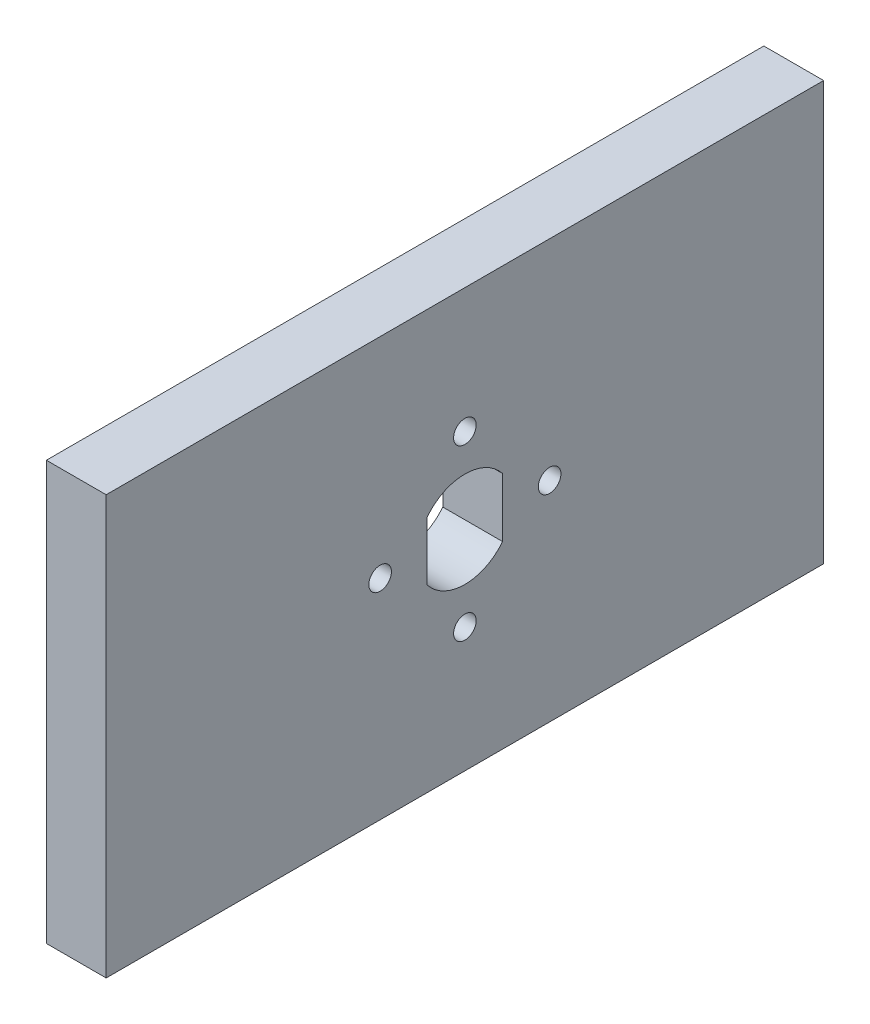
ISO-10303-21;
HEADER;
FILE_DESCRIPTION(('STEP AP214'),'2;1');
FILE_NAME('part.step','',(''),(''),'','','');
FILE_SCHEMA(('AUTOMOTIVE_DESIGN { 1 0 10303 214 1 1 1 1 }'));
ENDSEC;
DATA;
#1=APPLICATION_CONTEXT('core data for automotive mechanical design processes');
#2=APPLICATION_PROTOCOL_DEFINITION('international standard','automotive_design',2000,#1);
#3=PRODUCT_CONTEXT('',#1,'mechanical');
#4=PRODUCT('Part','Part','',(#3));
#5=PRODUCT_RELATED_PRODUCT_CATEGORY('part','',(#4));
#6=PRODUCT_DEFINITION_FORMATION('','',#4);
#7=PRODUCT_DEFINITION_CONTEXT('part definition',#1,'design');
#8=PRODUCT_DEFINITION('design','',#6,#7);
#9=PRODUCT_DEFINITION_SHAPE('','',#8);
#10=(LENGTH_UNIT() NAMED_UNIT(*) SI_UNIT(.MILLI.,.METRE.));
#11=(NAMED_UNIT(*) PLANE_ANGLE_UNIT() SI_UNIT($,.RADIAN.));
#12=(NAMED_UNIT(*) SI_UNIT($,.STERADIAN.) SOLID_ANGLE_UNIT());
#13=UNCERTAINTY_MEASURE_WITH_UNIT(LENGTH_MEASURE(1.E-05),#10,'distance_accuracy_value','');
#14=(GEOMETRIC_REPRESENTATION_CONTEXT(3) GLOBAL_UNCERTAINTY_ASSIGNED_CONTEXT((#13)) GLOBAL_UNIT_ASSIGNED_CONTEXT((#10,
#11,#12)) REPRESENTATION_CONTEXT('',''));
#15=CARTESIAN_POINT('',(0.,0.,0.));
#16=DIRECTION('',(0.,0.,1.));
#17=DIRECTION('',(1.,0.,0.));
#18=AXIS2_PLACEMENT_3D('',#15,#16,#17);
#19=CARTESIAN_POINT('',(3.175,0.,0.));
#20=DIRECTION('',(-1.,0.,0.));
#21=DIRECTION('',(0.,0.,1.));
#22=AXIS2_PLACEMENT_3D('',#19,#20,#21);
#23=PLANE('',#22);
#24=CARTESIAN_POINT('',(3.175,0.,-9.));
#25=DIRECTION('',(-1.,0.,0.));
#26=DIRECTION('',(0.,0.,1.));
#27=AXIS2_PLACEMENT_3D('',#24,#25,#26);
#28=CIRCLE('',#27,1.2);
#29=CARTESIAN_POINT('',(3.175,0.,-7.8));
#30=VERTEX_POINT('',#29);
#31=EDGE_CURVE('E272',#30,#30,#28,.T.);
#32=ORIENTED_EDGE('',*,*,#31,.T.);
#33=EDGE_LOOP('',(#32));
#34=FACE_BOUND('',#33,.T.);
#35=CARTESIAN_POINT('',(3.175,9.,0.));
#36=DIRECTION('',(-1.,0.,0.));
#37=DIRECTION('',(0.,0.,1.));
#38=AXIS2_PLACEMENT_3D('',#35,#36,#37);
#39=CIRCLE('',#38,1.2);
#40=CARTESIAN_POINT('',(3.175,9.,1.2));
#41=VERTEX_POINT('',#40);
#42=EDGE_CURVE('E276',#41,#41,#39,.T.);
#43=ORIENTED_EDGE('',*,*,#42,.T.);
#44=EDGE_LOOP('',(#43));
#45=FACE_BOUND('',#44,.T.);
#46=CARTESIAN_POINT('',(3.175,0.,9.));
#47=DIRECTION('',(-1.,0.,0.));
#48=DIRECTION('',(0.,0.,1.));
#49=AXIS2_PLACEMENT_3D('',#46,#47,#48);
#50=CIRCLE('',#49,1.2);
#51=CARTESIAN_POINT('',(3.175,0.,10.2));
#52=VERTEX_POINT('',#51);
#53=EDGE_CURVE('E285',#52,#52,#50,.T.);
#54=ORIENTED_EDGE('',*,*,#53,.T.);
#55=EDGE_LOOP('',(#54));
#56=FACE_BOUND('',#55,.T.);
#57=CARTESIAN_POINT('',(3.175,-9.,0.));
#58=DIRECTION('',(-1.,0.,0.));
#59=DIRECTION('',(0.,0.,1.));
#60=AXIS2_PLACEMENT_3D('',#57,#58,#59);
#61=CIRCLE('',#60,1.2);
#62=CARTESIAN_POINT('',(3.175,-9.,1.2));
#63=VERTEX_POINT('',#62);
#64=EDGE_CURVE('E120',#63,#63,#61,.T.);
#65=ORIENTED_EDGE('',*,*,#64,.T.);
#66=EDGE_LOOP('',(#65));
#67=FACE_BOUND('',#66,.T.);
#68=DIRECTION('',(0.,1.,0.));
#69=VECTOR('',#68,1.);
#70=CARTESIAN_POINT('',(3.175,-22.225,-38.1));
#71=LINE('',#70,#69);
#72=CARTESIAN_POINT('',(3.175,-22.225,-38.1));
#73=VERTEX_POINT('',#72);
#74=CARTESIAN_POINT('',(3.175,22.225,-38.1));
#75=VERTEX_POINT('',#74);
#76=EDGE_CURVE('E132',#73,#75,#71,.T.);
#77=ORIENTED_EDGE('',*,*,#76,.T.);
#78=DIRECTION('',(0.,0.,1.));
#79=VECTOR('',#78,1.);
#80=CARTESIAN_POINT('',(3.175,22.225,38.1));
#81=LINE('',#80,#79);
#82=CARTESIAN_POINT('',(3.175,22.225,38.1));
#83=VERTEX_POINT('',#82);
#84=EDGE_CURVE('E135',#75,#83,#81,.T.);
#85=ORIENTED_EDGE('',*,*,#84,.T.);
#86=DIRECTION('',(0.,-1.,0.));
#87=VECTOR('',#86,1.);
#88=CARTESIAN_POINT('',(3.175,-22.225,38.1));
#89=LINE('',#88,#87);
#90=CARTESIAN_POINT('',(3.175,-22.225,38.1));
#91=VERTEX_POINT('',#90);
#92=EDGE_CURVE('E138',#83,#91,#89,.T.);
#93=ORIENTED_EDGE('',*,*,#92,.T.);
#94=DIRECTION('',(0.,0.,-1.));
#95=VECTOR('',#94,1.);
#96=CARTESIAN_POINT('',(3.175,-22.225,38.1));
#97=LINE('',#96,#95);
#98=EDGE_CURVE('E140',#91,#73,#97,.T.);
#99=ORIENTED_EDGE('',*,*,#98,.T.);
#100=EDGE_LOOP('',(#77,#85,#93,#99));
#101=FACE_BOUND('',#100,.T.);
#102=DIRECTION('',(0.,1.,0.));
#103=VECTOR('',#102,1.);
#104=CARTESIAN_POINT('',(3.175,0.,-4.0005));
#105=LINE('',#104,#103);
#106=CARTESIAN_POINT('',(3.175,3.13087843104775,-4.0005));
#107=VERTEX_POINT('',#106);
#108=CARTESIAN_POINT('',(3.175,-3.13087843104775,-4.0005));
#109=VERTEX_POINT('',#108);
#110=EDGE_CURVE('E39',#107,#109,#105,.F.);
#111=ORIENTED_EDGE('',*,*,#110,.T.);
#112=CARTESIAN_POINT('',(3.175,0.,0.));
#113=DIRECTION('',(1.,0.,0.));
#114=DIRECTION('',(0.,0.,-1.));
#115=AXIS2_PLACEMENT_3D('',#112,#113,#114);
#116=CIRCLE('',#115,5.08);
#117=CARTESIAN_POINT('',(3.175,-3.13087843104775,4.0005));
#118=VERTEX_POINT('',#117);
#119=EDGE_CURVE('E160',#118,#109,#116,.T.);
#120=ORIENTED_EDGE('',*,*,#119,.F.);
#121=DIRECTION('',(0.,1.,0.));
#122=VECTOR('',#121,1.);
#123=CARTESIAN_POINT('',(3.175,0.,4.0005));
#124=LINE('',#123,#122);
#125=CARTESIAN_POINT('',(3.175,3.13087843104775,4.0005));
#126=VERTEX_POINT('',#125);
#127=EDGE_CURVE('E159',#126,#118,#124,.F.);
#128=ORIENTED_EDGE('',*,*,#127,.F.);
#129=CARTESIAN_POINT('',(3.175,0.,0.));
#130=DIRECTION('',(1.,0.,0.));
#131=DIRECTION('',(0.,0.,-1.));
#132=AXIS2_PLACEMENT_3D('',#129,#130,#131);
#133=CIRCLE('',#132,5.08);
#134=EDGE_CURVE('E129',#107,#126,#133,.T.);
#135=ORIENTED_EDGE('',*,*,#134,.F.);
#136=EDGE_LOOP('',(#111,#120,#128,#135));
#137=FACE_BOUND('',#136,.T.);
#138=ADVANCED_FACE('F35',(#34,#45,#56,#67,#101,#137),#23,.F.);
#139=CARTESIAN_POINT('',(-3.175,0.,0.));
#140=DIRECTION('',(-1.,0.,0.));
#141=DIRECTION('',(0.,0.,1.));
#142=AXIS2_PLACEMENT_3D('',#139,#140,#141);
#143=PLANE('',#142);
#144=CARTESIAN_POINT('',(-3.175,0.,-9.));
#145=DIRECTION('',(-1.,0.,0.));
#146=DIRECTION('',(0.,0.,1.));
#147=AXIS2_PLACEMENT_3D('',#144,#145,#146);
#148=CIRCLE('',#147,1.2);
#149=CARTESIAN_POINT('',(-3.175,0.,-7.8));
#150=VERTEX_POINT('',#149);
#151=EDGE_CURVE('E275',#150,#150,#148,.T.);
#152=ORIENTED_EDGE('',*,*,#151,.F.);
#153=EDGE_LOOP('',(#152));
#154=FACE_BOUND('',#153,.T.);
#155=CARTESIAN_POINT('',(-3.175,9.,0.));
#156=DIRECTION('',(-1.,0.,0.));
#157=DIRECTION('',(0.,0.,1.));
#158=AXIS2_PLACEMENT_3D('',#155,#156,#157);
#159=CIRCLE('',#158,1.2);
#160=CARTESIAN_POINT('',(-3.175,9.,1.2));
#161=VERTEX_POINT('',#160);
#162=EDGE_CURVE('E279',#161,#161,#159,.T.);
#163=ORIENTED_EDGE('',*,*,#162,.F.);
#164=EDGE_LOOP('',(#163));
#165=FACE_BOUND('',#164,.T.);
#166=CARTESIAN_POINT('',(-3.175,0.,9.));
#167=DIRECTION('',(-1.,0.,0.));
#168=DIRECTION('',(0.,0.,1.));
#169=AXIS2_PLACEMENT_3D('',#166,#167,#168);
#170=CIRCLE('',#169,1.2);
#171=CARTESIAN_POINT('',(-3.175,0.,10.2));
#172=VERTEX_POINT('',#171);
#173=EDGE_CURVE('E288',#172,#172,#170,.T.);
#174=ORIENTED_EDGE('',*,*,#173,.F.);
#175=EDGE_LOOP('',(#174));
#176=FACE_BOUND('',#175,.T.);
#177=CARTESIAN_POINT('',(-3.175,-9.,0.));
#178=DIRECTION('',(-1.,0.,0.));
#179=DIRECTION('',(0.,0.,1.));
#180=AXIS2_PLACEMENT_3D('',#177,#178,#179);
#181=CIRCLE('',#180,1.2);
#182=CARTESIAN_POINT('',(-3.175,-9.,1.2));
#183=VERTEX_POINT('',#182);
#184=EDGE_CURVE('E117',#183,#183,#181,.T.);
#185=ORIENTED_EDGE('',*,*,#184,.F.);
#186=EDGE_LOOP('',(#185));
#187=FACE_BOUND('',#186,.T.);
#188=DIRECTION('',(0.,1.,0.));
#189=VECTOR('',#188,1.);
#190=CARTESIAN_POINT('',(-3.175,-22.225,-38.1));
#191=LINE('',#190,#189);
#192=CARTESIAN_POINT('',(-3.175,-22.225,-38.1));
#193=VERTEX_POINT('',#192);
#194=CARTESIAN_POINT('',(-3.175,22.225,-38.1));
#195=VERTEX_POINT('',#194);
#196=EDGE_CURVE('E143',#193,#195,#191,.T.);
#197=ORIENTED_EDGE('',*,*,#196,.F.);
#198=DIRECTION('',(0.,0.,-1.));
#199=VECTOR('',#198,1.);
#200=CARTESIAN_POINT('',(-3.175,-22.225,38.1));
#201=LINE('',#200,#199);
#202=CARTESIAN_POINT('',(-3.175,-22.225,38.1));
#203=VERTEX_POINT('',#202);
#204=EDGE_CURVE('E136',#203,#193,#201,.T.);
#205=ORIENTED_EDGE('',*,*,#204,.F.);
#206=DIRECTION('',(0.,-1.,0.));
#207=VECTOR('',#206,1.);
#208=CARTESIAN_POINT('',(-3.175,-22.225,38.1));
#209=LINE('',#208,#207);
#210=CARTESIAN_POINT('',(-3.175,22.225,38.1));
#211=VERTEX_POINT('',#210);
#212=EDGE_CURVE('E148',#211,#203,#209,.T.);
#213=ORIENTED_EDGE('',*,*,#212,.F.);
#214=DIRECTION('',(0.,0.,1.));
#215=VECTOR('',#214,1.);
#216=CARTESIAN_POINT('',(-3.175,22.225,38.1));
#217=LINE('',#216,#215);
#218=EDGE_CURVE('E146',#195,#211,#217,.T.);
#219=ORIENTED_EDGE('',*,*,#218,.F.);
#220=EDGE_LOOP('',(#197,#205,#213,#219));
#221=FACE_BOUND('',#220,.T.);
#222=CARTESIAN_POINT('',(-3.175,0.,0.));
#223=DIRECTION('',(1.,0.,0.));
#224=DIRECTION('',(0.,0.,-1.));
#225=AXIS2_PLACEMENT_3D('',#222,#223,#224);
#226=CIRCLE('',#225,5.08);
#227=CARTESIAN_POINT('',(-3.175,-3.13087843104775,4.0005));
#228=VERTEX_POINT('',#227);
#229=CARTESIAN_POINT('',(-3.175,-3.13087843104775,-4.0005));
#230=VERTEX_POINT('',#229);
#231=EDGE_CURVE('E103',#228,#230,#226,.T.);
#232=ORIENTED_EDGE('',*,*,#231,.T.);
#233=DIRECTION('',(0.,-1.,0.));
#234=VECTOR('',#233,1.);
#235=CARTESIAN_POINT('',(-3.175,0.,-4.0005));
#236=LINE('',#235,#234);
#237=CARTESIAN_POINT('',(-3.175,3.13087843104775,-4.0005));
#238=VERTEX_POINT('',#237);
#239=EDGE_CURVE('E98',#238,#230,#236,.T.);
#240=ORIENTED_EDGE('',*,*,#239,.F.);
#241=CARTESIAN_POINT('',(-3.175,3.13087843104775,4.0005));
#242=VERTEX_POINT('',#241);
#243=EDGE_CURVE('E107',#238,#242,#226,.T.);
#244=ORIENTED_EDGE('',*,*,#243,.T.);
#245=DIRECTION('',(0.,-1.,0.));
#246=VECTOR('',#245,1.);
#247=CARTESIAN_POINT('',(-3.175,0.,4.0005));
#248=LINE('',#247,#246);
#249=EDGE_CURVE('E112',#242,#228,#248,.T.);
#250=ORIENTED_EDGE('',*,*,#249,.T.);
#251=EDGE_LOOP('',(#232,#240,#244,#250));
#252=FACE_BOUND('',#251,.T.);
#253=ADVANCED_FACE('F115',(#154,#165,#176,#187,#221,#252),#143,.T.);
#254=CARTESIAN_POINT('',(3.175,-22.225,-38.1));
#255=DIRECTION('',(0.,0.,1.));
#256=DIRECTION('',(1.,0.,0.));
#257=AXIS2_PLACEMENT_3D('',#254,#255,#256);
#258=PLANE('',#257);
#259=ORIENTED_EDGE('',*,*,#196,.T.);
#260=DIRECTION('',(-1.,0.,0.));
#261=VECTOR('',#260,1.);
#262=CARTESIAN_POINT('',(3.175,22.225,-38.1));
#263=LINE('',#262,#261);
#264=EDGE_CURVE('E11',#75,#195,#263,.T.);
#265=ORIENTED_EDGE('',*,*,#264,.F.);
#266=ORIENTED_EDGE('',*,*,#76,.F.);
#267=DIRECTION('',(-1.,0.,0.));
#268=VECTOR('',#267,1.);
#269=CARTESIAN_POINT('',(3.175,-22.225,-38.1));
#270=LINE('',#269,#268);
#271=EDGE_CURVE('E142',#73,#193,#270,.T.);
#272=ORIENTED_EDGE('',*,*,#271,.T.);
#273=EDGE_LOOP('',(#259,#265,#266,#272));
#274=FACE_BOUND('',#273,.T.);
#275=ADVANCED_FACE('F37',(#274),#258,.F.);
#276=CARTESIAN_POINT('',(3.175,22.225,38.1));
#277=DIRECTION('',(0.,-1.,0.));
#278=DIRECTION('',(0.,0.,-1.));
#279=AXIS2_PLACEMENT_3D('',#276,#277,#278);
#280=PLANE('',#279);
#281=ORIENTED_EDGE('',*,*,#218,.T.);
#282=DIRECTION('',(-1.,0.,0.));
#283=VECTOR('',#282,1.);
#284=CARTESIAN_POINT('',(3.175,22.225,38.1));
#285=LINE('',#284,#283);
#286=EDGE_CURVE('E45',#83,#211,#285,.T.);
#287=ORIENTED_EDGE('',*,*,#286,.F.);
#288=ORIENTED_EDGE('',*,*,#84,.F.);
#289=ORIENTED_EDGE('',*,*,#264,.T.);
#290=EDGE_LOOP('',(#281,#287,#288,#289));
#291=FACE_BOUND('',#290,.T.);
#292=ADVANCED_FACE('F197',(#291),#280,.F.);
#293=CARTESIAN_POINT('',(3.175,-22.225,38.1));
#294=DIRECTION('',(0.,0.,-1.));
#295=DIRECTION('',(-1.,0.,0.));
#296=AXIS2_PLACEMENT_3D('',#293,#294,#295);
#297=PLANE('',#296);
#298=ORIENTED_EDGE('',*,*,#212,.T.);
#299=DIRECTION('',(-1.,0.,0.));
#300=VECTOR('',#299,1.);
#301=CARTESIAN_POINT('',(3.175,-22.225,38.1));
#302=LINE('',#301,#300);
#303=EDGE_CURVE('E153',#91,#203,#302,.T.);
#304=ORIENTED_EDGE('',*,*,#303,.F.);
#305=ORIENTED_EDGE('',*,*,#92,.F.);
#306=ORIENTED_EDGE('',*,*,#286,.T.);
#307=EDGE_LOOP('',(#298,#304,#305,#306));
#308=FACE_BOUND('',#307,.T.);
#309=ADVANCED_FACE('F194',(#308),#297,.F.);
#310=CARTESIAN_POINT('',(3.175,-22.225,38.1));
#311=DIRECTION('',(0.,1.,0.));
#312=DIRECTION('',(0.,0.,1.));
#313=AXIS2_PLACEMENT_3D('',#310,#311,#312);
#314=PLANE('',#313);
#315=ORIENTED_EDGE('',*,*,#204,.T.);
#316=ORIENTED_EDGE('',*,*,#271,.F.);
#317=ORIENTED_EDGE('',*,*,#98,.F.);
#318=ORIENTED_EDGE('',*,*,#303,.T.);
#319=EDGE_LOOP('',(#315,#316,#317,#318));
#320=FACE_BOUND('',#319,.T.);
#321=ADVANCED_FACE('F176',(#320),#314,.F.);
#322=CARTESIAN_POINT('',(-3.175,0.,-4.0005));
#323=DIRECTION('',(0.,0.,1.));
#324=DIRECTION('',(1.,0.,0.));
#325=AXIS2_PLACEMENT_3D('',#322,#323,#324);
#326=PLANE('',#325);
#327=ORIENTED_EDGE('',*,*,#110,.F.);
#328=DIRECTION('',(1.,0.,0.));
#329=VECTOR('',#328,1.);
#330=CARTESIAN_POINT('',(-3.175,3.13087843104775,-4.0005));
#331=LINE('',#330,#329);
#332=EDGE_CURVE('E53',#238,#107,#331,.T.);
#333=ORIENTED_EDGE('',*,*,#332,.F.);
#334=ORIENTED_EDGE('',*,*,#239,.T.);
#335=DIRECTION('',(1.,0.,0.));
#336=VECTOR('',#335,1.);
#337=CARTESIAN_POINT('',(-3.175,-3.13087843104775,-4.0005));
#338=LINE('',#337,#336);
#339=EDGE_CURVE('E128',#230,#109,#338,.T.);
#340=ORIENTED_EDGE('',*,*,#339,.T.);
#341=EDGE_LOOP('',(#327,#333,#334,#340));
#342=FACE_BOUND('',#341,.T.);
#343=ADVANCED_FACE('F95',(#342),#326,.T.);
#344=CARTESIAN_POINT('',(-3.175,0.,0.));
#345=DIRECTION('',(1.,0.,0.));
#346=DIRECTION('',(0.,0.,-1.));
#347=AXIS2_PLACEMENT_3D('',#344,#345,#346);
#348=CYLINDRICAL_SURFACE('',#347,5.08);
#349=ORIENTED_EDGE('',*,*,#339,.F.);
#350=ORIENTED_EDGE('',*,*,#231,.F.);
#351=DIRECTION('',(1.,0.,0.));
#352=VECTOR('',#351,1.);
#353=CARTESIAN_POINT('',(-3.175,-3.13087843104775,4.0005));
#354=LINE('',#353,#352);
#355=EDGE_CURVE('E125',#228,#118,#354,.T.);
#356=ORIENTED_EDGE('',*,*,#355,.T.);
#357=ORIENTED_EDGE('',*,*,#119,.T.);
#358=EDGE_LOOP('',(#349,#350,#356,#357));
#359=FACE_BOUND('',#358,.T.);
#360=ADVANCED_FACE('F168',(#359),#348,.F.);
#361=CARTESIAN_POINT('',(-3.175,0.,4.0005));
#362=DIRECTION('',(0.,0.,1.));
#363=DIRECTION('',(1.,0.,0.));
#364=AXIS2_PLACEMENT_3D('',#361,#362,#363);
#365=PLANE('',#364);
#366=ORIENTED_EDGE('',*,*,#355,.F.);
#367=ORIENTED_EDGE('',*,*,#249,.F.);
#368=DIRECTION('',(1.,0.,0.));
#369=VECTOR('',#368,1.);
#370=CARTESIAN_POINT('',(-3.175,3.13087843104775,4.0005));
#371=LINE('',#370,#369);
#372=EDGE_CURVE('E102',#242,#126,#371,.T.);
#373=ORIENTED_EDGE('',*,*,#372,.T.);
#374=ORIENTED_EDGE('',*,*,#127,.T.);
#375=EDGE_LOOP('',(#366,#367,#373,#374));
#376=FACE_BOUND('',#375,.T.);
#377=ADVANCED_FACE('F167',(#376),#365,.F.);
#378=ORIENTED_EDGE('',*,*,#372,.F.);
#379=ORIENTED_EDGE('',*,*,#243,.F.);
#380=ORIENTED_EDGE('',*,*,#332,.T.);
#381=ORIENTED_EDGE('',*,*,#134,.T.);
#382=EDGE_LOOP('',(#378,#379,#380,#381));
#383=FACE_BOUND('',#382,.T.);
#384=ADVANCED_FACE('F108',(#383),#348,.F.);
#385=CARTESIAN_POINT('',(-3.175,-9.,0.));
#386=DIRECTION('',(-1.,0.,0.));
#387=DIRECTION('',(0.,0.,1.));
#388=AXIS2_PLACEMENT_3D('',#385,#386,#387);
#389=CYLINDRICAL_SURFACE('',#388,1.2);
#390=ORIENTED_EDGE('',*,*,#64,.F.);
#391=EDGE_LOOP('',(#390));
#392=FACE_BOUND('',#391,.T.);
#393=ORIENTED_EDGE('',*,*,#184,.T.);
#394=EDGE_LOOP('',(#393));
#395=FACE_BOUND('',#394,.T.);
#396=ADVANCED_FACE('F180',(#392,#395),#389,.F.);
#397=CARTESIAN_POINT('',(-3.175,0.,9.));
#398=DIRECTION('',(-1.,0.,0.));
#399=DIRECTION('',(0.,0.,1.));
#400=AXIS2_PLACEMENT_3D('',#397,#398,#399);
#401=CYLINDRICAL_SURFACE('',#400,1.2);
#402=ORIENTED_EDGE('',*,*,#53,.F.);
#403=EDGE_LOOP('',(#402));
#404=FACE_BOUND('',#403,.T.);
#405=ORIENTED_EDGE('',*,*,#173,.T.);
#406=EDGE_LOOP('',(#405));
#407=FACE_BOUND('',#406,.T.);
#408=ADVANCED_FACE('F236',(#404,#407),#401,.F.);
#409=CARTESIAN_POINT('',(-3.175,9.,0.));
#410=DIRECTION('',(-1.,0.,0.));
#411=DIRECTION('',(0.,0.,1.));
#412=AXIS2_PLACEMENT_3D('',#409,#410,#411);
#413=CYLINDRICAL_SURFACE('',#412,1.2);
#414=ORIENTED_EDGE('',*,*,#42,.F.);
#415=EDGE_LOOP('',(#414));
#416=FACE_BOUND('',#415,.T.);
#417=ORIENTED_EDGE('',*,*,#162,.T.);
#418=EDGE_LOOP('',(#417));
#419=FACE_BOUND('',#418,.T.);
#420=ADVANCED_FACE('F246',(#416,#419),#413,.F.);
#421=CARTESIAN_POINT('',(-3.175,0.,-9.));
#422=DIRECTION('',(-1.,0.,0.));
#423=DIRECTION('',(0.,0.,1.));
#424=AXIS2_PLACEMENT_3D('',#421,#422,#423);
#425=CYLINDRICAL_SURFACE('',#424,1.2);
#426=ORIENTED_EDGE('',*,*,#31,.F.);
#427=EDGE_LOOP('',(#426));
#428=FACE_BOUND('',#427,.T.);
#429=ORIENTED_EDGE('',*,*,#151,.T.);
#430=EDGE_LOOP('',(#429));
#431=FACE_BOUND('',#430,.T.);
#432=ADVANCED_FACE('F256',(#428,#431),#425,.F.);
#433=CLOSED_SHELL('',(#138,#253,#275,#292,#309,#321,#343,#360,#377,#384,#396,#408,#420,#432));
#434=MANIFOLD_SOLID_BREP('B2',#433);
#435=ADVANCED_BREP_SHAPE_REPRESENTATION('',(#18,#434),#14);
#436=SHAPE_DEFINITION_REPRESENTATION(#9,#435);
ENDSEC;
END-ISO-10303-21;
